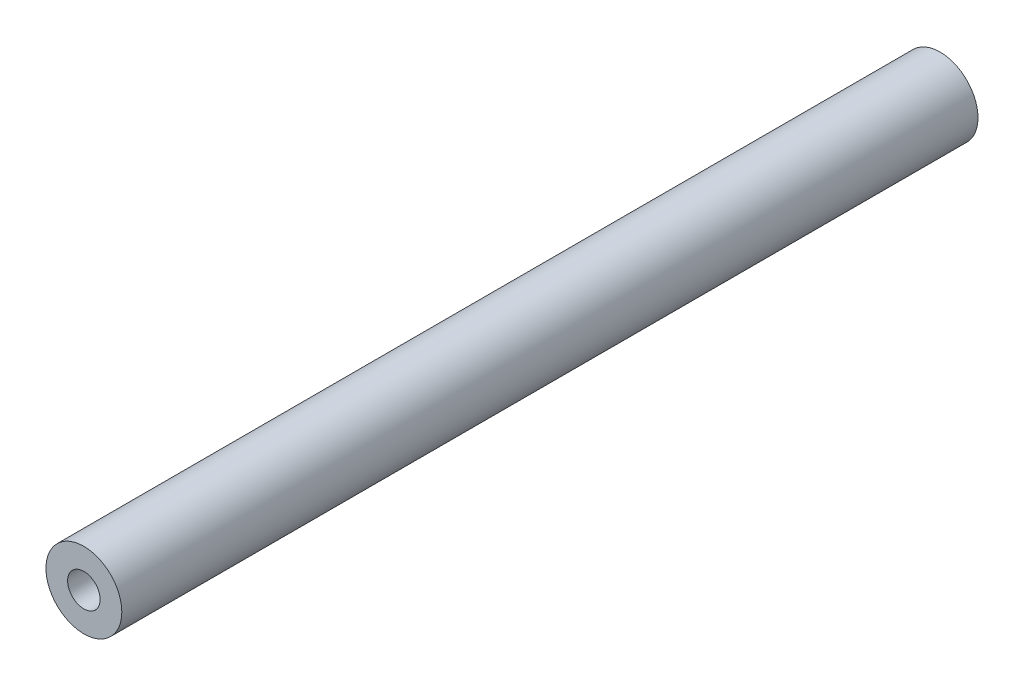
ISO-10303-21;
HEADER;
FILE_DESCRIPTION(('STEP AP214'),'2;1');
FILE_NAME('part.step','',(''),(''),'','','');
FILE_SCHEMA(('AUTOMOTIVE_DESIGN { 1 0 10303 214 1 1 1 1 }'));
ENDSEC;
DATA;
#1=APPLICATION_CONTEXT('core data for automotive mechanical design processes');
#2=APPLICATION_PROTOCOL_DEFINITION('international standard','automotive_design',2000,#1);
#3=PRODUCT_CONTEXT('',#1,'mechanical');
#4=PRODUCT('Part','Part','',(#3));
#5=PRODUCT_RELATED_PRODUCT_CATEGORY('part','',(#4));
#6=PRODUCT_DEFINITION_FORMATION('','',#4);
#7=PRODUCT_DEFINITION_CONTEXT('part definition',#1,'design');
#8=PRODUCT_DEFINITION('design','',#6,#7);
#9=PRODUCT_DEFINITION_SHAPE('','',#8);
#10=(LENGTH_UNIT() NAMED_UNIT(*) SI_UNIT(.MILLI.,.METRE.));
#11=(NAMED_UNIT(*) PLANE_ANGLE_UNIT() SI_UNIT($,.RADIAN.));
#12=(NAMED_UNIT(*) SI_UNIT($,.STERADIAN.) SOLID_ANGLE_UNIT());
#13=UNCERTAINTY_MEASURE_WITH_UNIT(LENGTH_MEASURE(1.E-05),#10,'distance_accuracy_value','');
#14=(GEOMETRIC_REPRESENTATION_CONTEXT(3) GLOBAL_UNCERTAINTY_ASSIGNED_CONTEXT((#13)) GLOBAL_UNIT_ASSIGNED_CONTEXT((#10,
#11,#12)) REPRESENTATION_CONTEXT('',''));
#15=CARTESIAN_POINT('',(0.,0.,0.));
#16=DIRECTION('',(0.,0.,1.));
#17=DIRECTION('',(1.,0.,0.));
#18=AXIS2_PLACEMENT_3D('',#15,#16,#17);
#19=CARTESIAN_POINT('',(0.,0.,39.5));
#20=DIRECTION('',(0.,0.,1.));
#21=DIRECTION('',(1.,0.,0.));
#22=AXIS2_PLACEMENT_3D('',#19,#20,#21);
#23=PLANE('',#22);
#24=CARTESIAN_POINT('',(0.,0.,39.5));
#25=DIRECTION('',(0.,0.,1.));
#26=DIRECTION('',(1.,0.,0.));
#27=AXIS2_PLACEMENT_3D('',#24,#25,#26);
#28=CIRCLE('',#27,3.5);
#29=CARTESIAN_POINT('',(3.5,0.,39.5));
#30=VERTEX_POINT('',#29);
#31=EDGE_CURVE('E10',#30,#30,#28,.T.);
#32=ORIENTED_EDGE('',*,*,#31,.T.);
#33=EDGE_LOOP('',(#32));
#34=FACE_BOUND('',#33,.T.);
#35=CARTESIAN_POINT('',(0.,0.,39.5));
#36=DIRECTION('',(0.,0.,1.));
#37=DIRECTION('',(1.,0.,0.));
#38=AXIS2_PLACEMENT_3D('',#35,#36,#37);
#39=CIRCLE('',#38,1.5);
#40=CARTESIAN_POINT('',(1.5,0.,39.5));
#41=VERTEX_POINT('',#40);
#42=EDGE_CURVE('E44',#41,#41,#39,.T.);
#43=ORIENTED_EDGE('',*,*,#42,.F.);
#44=EDGE_LOOP('',(#43));
#45=FACE_BOUND('',#44,.T.);
#46=ADVANCED_FACE('F33',(#34,#45),#23,.T.);
#47=CARTESIAN_POINT('',(0.,0.,-39.5));
#48=DIRECTION('',(0.,0.,1.));
#49=DIRECTION('',(1.,0.,0.));
#50=AXIS2_PLACEMENT_3D('',#47,#48,#49);
#51=PLANE('',#50);
#52=CARTESIAN_POINT('',(0.,0.,-39.5));
#53=DIRECTION('',(0.,0.,1.));
#54=DIRECTION('',(1.,0.,0.));
#55=AXIS2_PLACEMENT_3D('',#52,#53,#54);
#56=CIRCLE('',#55,3.5);
#57=CARTESIAN_POINT('',(3.5,0.,-39.5));
#58=VERTEX_POINT('',#57);
#59=EDGE_CURVE('E37',#58,#58,#56,.T.);
#60=ORIENTED_EDGE('',*,*,#59,.F.);
#61=EDGE_LOOP('',(#60));
#62=FACE_BOUND('',#61,.T.);
#63=CARTESIAN_POINT('',(0.,0.,-39.5));
#64=DIRECTION('',(0.,0.,1.));
#65=DIRECTION('',(1.,0.,0.));
#66=AXIS2_PLACEMENT_3D('',#63,#64,#65);
#67=CIRCLE('',#66,1.5);
#68=CARTESIAN_POINT('',(1.5,0.,-39.5));
#69=VERTEX_POINT('',#68);
#70=EDGE_CURVE('E46',#69,#69,#67,.T.);
#71=ORIENTED_EDGE('',*,*,#70,.T.);
#72=EDGE_LOOP('',(#71));
#73=FACE_BOUND('',#72,.T.);
#74=ADVANCED_FACE('F56',(#62,#73),#51,.F.);
#75=CARTESIAN_POINT('',(0.,0.,39.5));
#76=DIRECTION('',(0.,0.,-1.));
#77=DIRECTION('',(-1.,0.,0.));
#78=AXIS2_PLACEMENT_3D('',#75,#76,#77);
#79=CYLINDRICAL_SURFACE('',#78,3.5);
#80=ORIENTED_EDGE('',*,*,#31,.F.);
#81=EDGE_LOOP('',(#80));
#82=FACE_BOUND('',#81,.T.);
#83=ORIENTED_EDGE('',*,*,#59,.T.);
#84=EDGE_LOOP('',(#83));
#85=FACE_BOUND('',#84,.T.);
#86=ADVANCED_FACE('F35',(#82,#85),#79,.T.);
#87=CARTESIAN_POINT('',(0.,0.,39.5));
#88=DIRECTION('',(0.,0.,-1.));
#89=DIRECTION('',(-1.,0.,0.));
#90=AXIS2_PLACEMENT_3D('',#87,#88,#89);
#91=CYLINDRICAL_SURFACE('',#90,1.5);
#92=ORIENTED_EDGE('',*,*,#42,.T.);
#93=EDGE_LOOP('',(#92));
#94=FACE_BOUND('',#93,.T.);
#95=ORIENTED_EDGE('',*,*,#70,.F.);
#96=EDGE_LOOP('',(#95));
#97=FACE_BOUND('',#96,.T.);
#98=ADVANCED_FACE('F52',(#94,#97),#91,.F.);
#99=CLOSED_SHELL('',(#46,#74,#86,#98));
#100=MANIFOLD_SOLID_BREP('B2',#99);
#101=ADVANCED_BREP_SHAPE_REPRESENTATION('',(#18,#100),#14);
#102=SHAPE_DEFINITION_REPRESENTATION(#9,#101);
ENDSEC;
END-ISO-10303-21;
